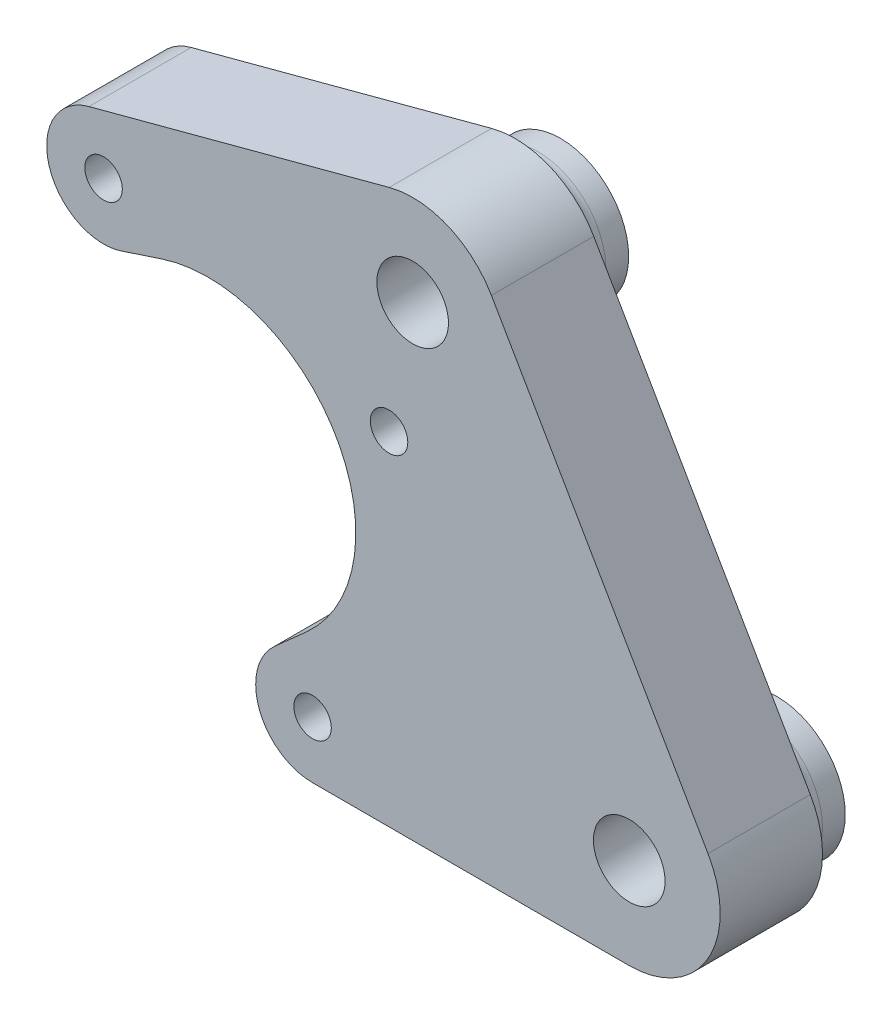
ISO-10303-21;
HEADER;
FILE_DESCRIPTION(('STEP AP214'),'2;1');
FILE_NAME('part.step','',(''),(''),'','','');
FILE_SCHEMA(('AUTOMOTIVE_DESIGN { 1 0 10303 214 1 1 1 1 }'));
ENDSEC;
DATA;
#1=APPLICATION_CONTEXT('core data for automotive mechanical design processes');
#2=APPLICATION_PROTOCOL_DEFINITION('international standard','automotive_design',2000,#1);
#3=PRODUCT_CONTEXT('',#1,'mechanical');
#4=PRODUCT('Part','Part','',(#3));
#5=PRODUCT_RELATED_PRODUCT_CATEGORY('part','',(#4));
#6=PRODUCT_DEFINITION_FORMATION('','',#4);
#7=PRODUCT_DEFINITION_CONTEXT('part definition',#1,'design');
#8=PRODUCT_DEFINITION('design','',#6,#7);
#9=PRODUCT_DEFINITION_SHAPE('','',#8);
#10=(LENGTH_UNIT() NAMED_UNIT(*) SI_UNIT(.MILLI.,.METRE.));
#11=(NAMED_UNIT(*) PLANE_ANGLE_UNIT() SI_UNIT($,.RADIAN.));
#12=(NAMED_UNIT(*) SI_UNIT($,.STERADIAN.) SOLID_ANGLE_UNIT());
#13=UNCERTAINTY_MEASURE_WITH_UNIT(LENGTH_MEASURE(1.E-05),#10,'distance_accuracy_value','');
#14=(GEOMETRIC_REPRESENTATION_CONTEXT(3) GLOBAL_UNCERTAINTY_ASSIGNED_CONTEXT((#13)) GLOBAL_UNIT_ASSIGNED_CONTEXT((#10,
#11,#12)) REPRESENTATION_CONTEXT('',''));
#15=CARTESIAN_POINT('',(0.,0.,0.));
#16=DIRECTION('',(0.,0.,1.));
#17=DIRECTION('',(1.,0.,0.));
#18=AXIS2_PLACEMENT_3D('',#15,#16,#17);
#19=CARTESIAN_POINT('',(18.,20.07,0.));
#20=DIRECTION('',(0.,0.,1.));
#21=DIRECTION('',(1.,0.,0.));
#22=AXIS2_PLACEMENT_3D('',#19,#20,#21);
#23=PLANE('',#22);
#24=DIRECTION('',(-0.499999999999998,0.86602540378444,0.));
#25=VECTOR('',#24,1.);
#26=CARTESIAN_POINT('',(24.9282032302755,24.07,0.));
#27=LINE('',#26,#25);
#28=CARTESIAN_POINT('',(43.9807032302754,-8.92989801120609,0.));
#29=VERTEX_POINT('',#28);
#30=CARTESIAN_POINT('',(24.9282032302755,24.07,0.));
#31=VERTEX_POINT('',#30);
#32=EDGE_CURVE('E240',#29,#31,#27,.T.);
#33=ORIENTED_EDGE('',*,*,#32,.F.);
#34=CARTESIAN_POINT('',(37.0524999999999,-12.9298980112061,0.));
#35=DIRECTION('',(0.,0.,1.));
#36=DIRECTION('',(1.,0.,0.));
#37=AXIS2_PLACEMENT_3D('',#34,#35,#36);
#38=CIRCLE('',#37,8.);
#39=CARTESIAN_POINT('',(37.0501411255726,-20.929897663438,0.));
#40=VERTEX_POINT('',#39);
#41=EDGE_CURVE('E317',#29,#40,#38,.T.);
#42=ORIENTED_EDGE('',*,*,#41,.T.);
#43=DIRECTION('',(0.999999956528995,-0.000294859303409234,0.));
#44=VECTOR('',#43,1.);
#45=CARTESIAN_POINT('',(37.0501411255726,-20.929897663438,0.));
#46=LINE('',#45,#44);
#47=CARTESIAN_POINT('',(9.19091385890818,-20.9216831107356,0.));
#48=VERTEX_POINT('',#47);
#49=EDGE_CURVE('E268',#48,#40,#46,.T.);
#50=ORIENTED_EDGE('',*,*,#49,.F.);
#51=CARTESIAN_POINT('',(9.19238815542522,-15.9216833280906,0.));
#52=DIRECTION('',(0.,0.,1.));
#53=DIRECTION('',(1.,0.,0.));
#54=AXIS2_PLACEMENT_3D('',#51,#52,#53);
#55=CIRCLE('',#54,5.);
#56=CARTESIAN_POINT('',(7.80290130845949,-20.7247371797676,0.));
#57=VERTEX_POINT('',#56);
#58=EDGE_CURVE('E266',#57,#48,#55,.T.);
#59=ORIENTED_EDGE('',*,*,#58,.F.);
#60=DIRECTION('',(-0.866025403784435,-0.500000000000006,0.));
#61=VECTOR('',#60,1.);
#62=CARTESIAN_POINT('',(13.8029502171025,-17.2606073272116,0.));
#63=LINE('',#62,#61);
#64=CARTESIAN_POINT('',(13.8029502171025,-17.2606073272116,0.));
#65=VERTEX_POINT('',#64);
#66=EDGE_CURVE('E446',#65,#57,#63,.T.);
#67=ORIENTED_EDGE('',*,*,#66,.F.);
#68=DIRECTION('',(-0.258819045102514,-0.96592582628907,0.));
#69=VECTOR('',#68,1.);
#70=CARTESIAN_POINT('',(20.5840091987884,8.04664932156206,0.));
#71=LINE('',#70,#69);
#72=CARTESIAN_POINT('',(20.5840091987884,8.04664932156206,0.));
#73=VERTEX_POINT('',#72);
#74=EDGE_CURVE('E174',#73,#65,#71,.T.);
#75=ORIENTED_EDGE('',*,*,#74,.F.);
#76=DIRECTION('',(0.500000000000006,-0.866025403784435,0.));
#77=VECTOR('',#76,1.);
#78=CARTESIAN_POINT('',(17.2606073272116,13.8029502171025,0.));
#79=LINE('',#78,#77);
#80=CARTESIAN_POINT('',(18.2587107953935,12.0741842990007,0.));
#81=VERTEX_POINT('',#80);
#82=EDGE_CURVE('E187',#81,#73,#79,.T.);
#83=ORIENTED_EDGE('',*,*,#82,.F.);
#84=CARTESIAN_POINT('',(18.,20.07,0.));
#85=DIRECTION('',(0.,0.,1.));
#86=DIRECTION('',(1.,0.,0.));
#87=AXIS2_PLACEMENT_3D('',#84,#85,#86);
#88=CIRCLE('',#87,8.);
#89=EDGE_CURVE('E314',#81,#31,#88,.T.);
#90=ORIENTED_EDGE('',*,*,#89,.T.);
#91=EDGE_LOOP('',(#33,#42,#50,#59,#67,#75,#83,#90));
#92=FACE_BOUND('',#91,.T.);
#93=ADVANCED_FACE('F33',(#92),#23,.F.);
#94=DIRECTION('',(-0.966218110251207,-0.257725752346532,0.));
#95=VECTOR('',#94,1.);
#96=CARTESIAN_POINT('',(15.9381939812277,27.7997448820097,0.));
#97=LINE('',#96,#95);
#98=CARTESIAN_POINT('',(15.9381939812277,27.7997448820097,0.));
#99=VERTEX_POINT('',#98);
#100=CARTESIAN_POINT('',(-10.4810169171579,20.7527738793466,0.));
#101=VERTEX_POINT('',#100);
#102=EDGE_CURVE('E261',#99,#101,#97,.T.);
#103=ORIENTED_EDGE('',*,*,#102,.F.);
#104=CARTESIAN_POINT('',(18.,20.07,0.));
#105=DIRECTION('',(0.,0.,1.));
#106=DIRECTION('',(1.,0.,0.));
#107=AXIS2_PLACEMENT_3D('',#104,#105,#106);
#108=CIRCLE('',#107,8.);
#109=CARTESIAN_POINT('',(11.5539290879817,15.3320500427684,0.));
#110=VERTEX_POINT('',#109);
#111=EDGE_CURVE('E60',#99,#110,#108,.T.);
#112=ORIENTED_EDGE('',*,*,#111,.T.);
#113=DIRECTION('',(0.96592582628907,-0.258819045102514,0.));
#114=VECTOR('',#113,1.);
#115=CARTESIAN_POINT('',(-8.04664932156206,20.5840091987884,0.));
#116=LINE('',#115,#114);
#117=CARTESIAN_POINT('',(-8.04664932156206,20.5840091987884,0.));
#118=VERTEX_POINT('',#117);
#119=EDGE_CURVE('E181',#118,#110,#116,.T.);
#120=ORIENTED_EDGE('',*,*,#119,.F.);
#121=DIRECTION('',(0.866025403784435,0.500000000000006,0.));
#122=VECTOR('',#121,1.);
#123=CARTESIAN_POINT('',(-22.3804370332829,12.3083930049193,0.));
#124=LINE('',#123,#122);
#125=CARTESIAN_POINT('',(-14.0466982302051,17.1198793462324,0.));
#126=VERTEX_POINT('',#125);
#127=EDGE_CURVE('E183',#126,#118,#124,.T.);
#128=ORIENTED_EDGE('',*,*,#127,.F.);
#129=CARTESIAN_POINT('',(-9.19238815542523,15.9216833280906,0.));
#130=DIRECTION('',(0.,0.,1.));
#131=DIRECTION('',(1.,0.,0.));
#132=AXIS2_PLACEMENT_3D('',#129,#130,#131);
#133=CIRCLE('',#132,5.);
#134=EDGE_CURVE('E263',#101,#126,#133,.T.);
#135=ORIENTED_EDGE('',*,*,#134,.F.);
#136=EDGE_LOOP('',(#103,#112,#120,#128,#135));
#137=FACE_BOUND('',#136,.T.);
#138=ADVANCED_FACE('F370',(#137),#23,.F.);
#139=CARTESIAN_POINT('',(18.,20.07,9.));
#140=DIRECTION('',(0.,0.,1.));
#141=DIRECTION('',(1.,0.,0.));
#142=AXIS2_PLACEMENT_3D('',#139,#140,#141);
#143=PLANE('',#142);
#144=CARTESIAN_POINT('',(18.,20.07,9.));
#145=DIRECTION('',(0.,0.,1.));
#146=DIRECTION('',(1.,0.,0.));
#147=AXIS2_PLACEMENT_3D('',#144,#145,#146);
#148=CIRCLE('',#147,3.15);
#149=CARTESIAN_POINT('',(21.15,20.07,9.));
#150=VERTEX_POINT('',#149);
#151=EDGE_CURVE('E223',#150,#150,#148,.T.);
#152=ORIENTED_EDGE('',*,*,#151,.F.);
#153=EDGE_LOOP('',(#152));
#154=FACE_BOUND('',#153,.T.);
#155=CARTESIAN_POINT('',(15.9216833280906,9.19238815542522,9.));
#156=DIRECTION('',(0.,0.,1.));
#157=DIRECTION('',(1.,0.,0.));
#158=AXIS2_PLACEMENT_3D('',#155,#156,#157);
#159=CIRCLE('',#158,1.65);
#160=CARTESIAN_POINT('',(17.5716833280906,9.19238815542522,9.));
#161=VERTEX_POINT('',#160);
#162=EDGE_CURVE('E229',#161,#161,#159,.T.);
#163=ORIENTED_EDGE('',*,*,#162,.F.);
#164=EDGE_LOOP('',(#163));
#165=FACE_BOUND('',#164,.T.);
#166=CARTESIAN_POINT('',(18.,20.07,9.));
#167=DIRECTION('',(0.,0.,1.));
#168=DIRECTION('',(1.,0.,0.));
#169=AXIS2_PLACEMENT_3D('',#166,#167,#168);
#170=CIRCLE('',#169,8.);
#171=CARTESIAN_POINT('',(24.9282032302755,24.07,9.));
#172=VERTEX_POINT('',#171);
#173=CARTESIAN_POINT('',(15.9381939812277,27.7997448820097,9.));
#174=VERTEX_POINT('',#173);
#175=EDGE_CURVE('E236',#172,#174,#170,.T.);
#176=ORIENTED_EDGE('',*,*,#175,.T.);
#177=DIRECTION('',(-0.966218110251207,-0.257725752346532,0.));
#178=VECTOR('',#177,1.);
#179=CARTESIAN_POINT('',(15.9381939812277,27.7997448820097,9.));
#180=LINE('',#179,#178);
#181=CARTESIAN_POINT('',(-10.4810169171579,20.7527738793466,9.));
#182=VERTEX_POINT('',#181);
#183=EDGE_CURVE('E239',#174,#182,#180,.T.);
#184=ORIENTED_EDGE('',*,*,#183,.T.);
#185=CARTESIAN_POINT('',(-9.19238815542523,15.9216833280906,9.));
#186=DIRECTION('',(0.,0.,1.));
#187=DIRECTION('',(1.,0.,0.));
#188=AXIS2_PLACEMENT_3D('',#185,#186,#187);
#189=CIRCLE('',#188,5.);
#190=CARTESIAN_POINT('',(-7.62597539265558,11.1733835211458,9.));
#191=VERTEX_POINT('',#190);
#192=EDGE_CURVE('E242',#182,#191,#189,.T.);
#193=ORIENTED_EDGE('',*,*,#192,.T.);
#194=DIRECTION('',(0.949659961388967,0.31328255255393,0.));
#195=VECTOR('',#194,1.);
#196=CARTESIAN_POINT('',(-4.07267318320108,12.3455794980566,9.));
#197=LINE('',#196,#195);
#198=CARTESIAN_POINT('',(-4.07267318320108,12.3455794980566,9.));
#199=VERTEX_POINT('',#198);
#200=EDGE_CURVE('E244',#191,#199,#197,.T.);
#201=ORIENTED_EDGE('',*,*,#200,.T.);
#202=CARTESIAN_POINT('',(0.,0.,9.));
#203=DIRECTION('',(0.,0.,-1.));
#204=DIRECTION('',(1.,0.,0.));
#205=AXIS2_PLACEMENT_3D('',#202,#203,#204);
#206=CIRCLE('',#205,13.);
#207=CARTESIAN_POINT('',(8.65524887815692,-9.69982818699195,9.));
#208=VERTEX_POINT('',#207);
#209=EDGE_CURVE('E246',#199,#208,#206,.T.);
#210=ORIENTED_EDGE('',*,*,#209,.T.);
#211=DIRECTION('',(-0.746140629768612,-0.665788375242839,0.));
#212=VECTOR('',#211,1.);
#213=CARTESIAN_POINT('',(8.65524887815692,-9.69982818699195,9.));
#214=LINE('',#213,#212);
#215=CARTESIAN_POINT('',(5.86344627921102,-12.1909801792475,9.));
#216=VERTEX_POINT('',#215);
#217=EDGE_CURVE('E248',#208,#216,#214,.T.);
#218=ORIENTED_EDGE('',*,*,#217,.T.);
#219=CARTESIAN_POINT('',(9.19238815542522,-15.9216833280906,9.));
#220=DIRECTION('',(0.,0.,1.));
#221=DIRECTION('',(1.,0.,0.));
#222=AXIS2_PLACEMENT_3D('',#219,#220,#221);
#223=CIRCLE('',#222,5.);
#224=CARTESIAN_POINT('',(9.19091385890818,-20.9216831107356,9.));
#225=VERTEX_POINT('',#224);
#226=EDGE_CURVE('E250',#216,#225,#223,.T.);
#227=ORIENTED_EDGE('',*,*,#226,.T.);
#228=DIRECTION('',(0.999999956528995,-0.000294859303409234,0.));
#229=VECTOR('',#228,1.);
#230=CARTESIAN_POINT('',(37.0501411255726,-20.929897663438,9.));
#231=LINE('',#230,#229);
#232=CARTESIAN_POINT('',(37.0501411255726,-20.929897663438,9.));
#233=VERTEX_POINT('',#232);
#234=EDGE_CURVE('E252',#225,#233,#231,.T.);
#235=ORIENTED_EDGE('',*,*,#234,.T.);
#236=CARTESIAN_POINT('',(37.0524999999999,-12.9298980112061,9.));
#237=DIRECTION('',(0.,0.,1.));
#238=DIRECTION('',(1.,0.,0.));
#239=AXIS2_PLACEMENT_3D('',#236,#237,#238);
#240=CIRCLE('',#239,8.);
#241=CARTESIAN_POINT('',(43.9807032302754,-8.92989801120609,9.));
#242=VERTEX_POINT('',#241);
#243=EDGE_CURVE('E254',#233,#242,#240,.T.);
#244=ORIENTED_EDGE('',*,*,#243,.T.);
#245=DIRECTION('',(-0.499999999999998,0.86602540378444,0.));
#246=VECTOR('',#245,1.);
#247=CARTESIAN_POINT('',(24.9282032302755,24.07,9.));
#248=LINE('',#247,#246);
#249=EDGE_CURVE('E256',#242,#172,#248,.T.);
#250=ORIENTED_EDGE('',*,*,#249,.T.);
#251=EDGE_LOOP('',(#176,#184,#193,#201,#210,#218,#227,#235,#244,#250));
#252=FACE_BOUND('',#251,.T.);
#253=CARTESIAN_POINT('',(-9.19238815542523,15.9216833280906,9.));
#254=DIRECTION('',(0.,0.,1.));
#255=DIRECTION('',(1.,0.,0.));
#256=AXIS2_PLACEMENT_3D('',#253,#254,#255);
#257=CIRCLE('',#256,1.65);
#258=CARTESIAN_POINT('',(-7.54238815542522,15.9216833280906,9.));
#259=VERTEX_POINT('',#258);
#260=EDGE_CURVE('E232',#259,#259,#257,.T.);
#261=ORIENTED_EDGE('',*,*,#260,.F.);
#262=EDGE_LOOP('',(#261));
#263=FACE_BOUND('',#262,.T.);
#264=CARTESIAN_POINT('',(9.19238815542522,-15.9216833280906,9.));
#265=DIRECTION('',(0.,0.,1.));
#266=DIRECTION('',(1.,0.,0.));
#267=AXIS2_PLACEMENT_3D('',#264,#265,#266);
#268=CIRCLE('',#267,1.65);
#269=CARTESIAN_POINT('',(10.8423881554252,-15.9216833280906,9.));
#270=VERTEX_POINT('',#269);
#271=EDGE_CURVE('E226',#270,#270,#268,.T.);
#272=ORIENTED_EDGE('',*,*,#271,.F.);
#273=EDGE_LOOP('',(#272));
#274=FACE_BOUND('',#273,.T.);
#275=CARTESIAN_POINT('',(37.0524999999999,-12.9298980112061,9.));
#276=DIRECTION('',(0.,0.,1.));
#277=DIRECTION('',(1.,0.,0.));
#278=AXIS2_PLACEMENT_3D('',#275,#276,#277);
#279=CIRCLE('',#278,3.14999999999999);
#280=CARTESIAN_POINT('',(40.2024999999999,-12.9298980112061,9.));
#281=VERTEX_POINT('',#280);
#282=EDGE_CURVE('E220',#281,#281,#279,.T.);
#283=ORIENTED_EDGE('',*,*,#282,.F.);
#284=EDGE_LOOP('',(#283));
#285=FACE_BOUND('',#284,.T.);
#286=ADVANCED_FACE('F366',(#154,#165,#252,#263,#274,#285),#143,.T.);
#287=CARTESIAN_POINT('',(18.,20.07,9.));
#288=DIRECTION('',(0.,0.,-1.));
#289=DIRECTION('',(-1.,0.,0.));
#290=AXIS2_PLACEMENT_3D('',#287,#288,#289);
#291=CYLINDRICAL_SURFACE('',#290,8.);
#292=CARTESIAN_POINT('',(18.,20.07,0.));
#293=DIRECTION('',(0.,0.,1.));
#294=DIRECTION('',(1.,0.,0.));
#295=AXIS2_PLACEMENT_3D('',#292,#293,#294);
#296=CIRCLE('',#295,8.);
#297=EDGE_CURVE('E235',#31,#99,#296,.T.);
#298=ORIENTED_EDGE('',*,*,#297,.T.);
#299=DIRECTION('',(0.,0.,-1.));
#300=VECTOR('',#299,1.);
#301=CARTESIAN_POINT('',(15.9381939812277,27.7997448820097,9.));
#302=LINE('',#301,#300);
#303=EDGE_CURVE('E301',#174,#99,#302,.T.);
#304=ORIENTED_EDGE('',*,*,#303,.F.);
#305=ORIENTED_EDGE('',*,*,#175,.F.);
#306=DIRECTION('',(0.,0.,-1.));
#307=VECTOR('',#306,1.);
#308=CARTESIAN_POINT('',(24.9282032302755,24.07,9.));
#309=LINE('',#308,#307);
#310=EDGE_CURVE('E258',#172,#31,#309,.T.);
#311=ORIENTED_EDGE('',*,*,#310,.T.);
#312=EDGE_LOOP('',(#298,#304,#305,#311));
#313=FACE_BOUND('',#312,.T.);
#314=ADVANCED_FACE('F369',(#313),#291,.T.);
#315=CARTESIAN_POINT('',(15.9381939812277,27.7997448820097,9.));
#316=DIRECTION('',(0.257725752346532,-0.966218110251207,0.));
#317=DIRECTION('',(0.966218110251207,0.257725752346532,0.));
#318=AXIS2_PLACEMENT_3D('',#315,#316,#317);
#319=PLANE('',#318);
#320=ORIENTED_EDGE('',*,*,#102,.T.);
#321=DIRECTION('',(0.,0.,-1.));
#322=VECTOR('',#321,1.);
#323=CARTESIAN_POINT('',(-10.4810169171579,20.7527738793466,9.));
#324=LINE('',#323,#322);
#325=EDGE_CURVE('E298',#182,#101,#324,.T.);
#326=ORIENTED_EDGE('',*,*,#325,.F.);
#327=ORIENTED_EDGE('',*,*,#183,.F.);
#328=ORIENTED_EDGE('',*,*,#303,.T.);
#329=EDGE_LOOP('',(#320,#326,#327,#328));
#330=FACE_BOUND('',#329,.T.);
#331=ADVANCED_FACE('F404',(#330),#319,.F.);
#332=CARTESIAN_POINT('',(-9.19238815542523,15.9216833280906,9.));
#333=DIRECTION('',(0.,0.,-1.));
#334=DIRECTION('',(-1.,0.,0.));
#335=AXIS2_PLACEMENT_3D('',#332,#333,#334);
#336=CYLINDRICAL_SURFACE('',#335,5.);
#337=DIRECTION('',(0.,0.,-1.));
#338=VECTOR('',#337,1.);
#339=CARTESIAN_POINT('',(-14.0466982302051,17.1198793462324,9.));
#340=LINE('',#339,#338);
#341=CARTESIAN_POINT('',(-14.0466982302051,17.1198793462324,3.));
#342=VERTEX_POINT('',#341);
#343=EDGE_CURVE('E307',#126,#342,#340,.F.);
#344=ORIENTED_EDGE('',*,*,#343,.T.);
#345=CARTESIAN_POINT('',(-9.19238815542523,15.9216833280906,3.));
#346=DIRECTION('',(0.,0.,1.));
#347=DIRECTION('',(1.,0.,0.));
#348=AXIS2_PLACEMENT_3D('',#345,#346,#347);
#349=CIRCLE('',#348,5.);
#350=CARTESIAN_POINT('',(-7.62597539265558,11.1733835211458,3.));
#351=VERTEX_POINT('',#350);
#352=EDGE_CURVE('E217',#342,#351,#349,.T.);
#353=ORIENTED_EDGE('',*,*,#352,.T.);
#354=DIRECTION('',(0.,0.,-1.));
#355=VECTOR('',#354,1.);
#356=CARTESIAN_POINT('',(-7.62597539265558,11.1733835211458,9.));
#357=LINE('',#356,#355);
#358=EDGE_CURVE('E295',#191,#351,#357,.T.);
#359=ORIENTED_EDGE('',*,*,#358,.F.);
#360=ORIENTED_EDGE('',*,*,#192,.F.);
#361=ORIENTED_EDGE('',*,*,#325,.T.);
#362=ORIENTED_EDGE('',*,*,#134,.T.);
#363=EDGE_LOOP('',(#344,#353,#359,#360,#361,#362));
#364=FACE_BOUND('',#363,.T.);
#365=ADVANCED_FACE('F400',(#364),#336,.T.);
#366=CARTESIAN_POINT('',(-4.07267318320108,12.3455794980566,9.));
#367=DIRECTION('',(-0.31328255255393,0.949659961388967,0.));
#368=DIRECTION('',(-0.949659961388967,-0.31328255255393,0.));
#369=AXIS2_PLACEMENT_3D('',#366,#367,#368);
#370=PLANE('',#369);
#371=ORIENTED_EDGE('',*,*,#358,.T.);
#372=DIRECTION('',(0.949659961388967,0.31328255255393,0.));
#373=VECTOR('',#372,1.);
#374=CARTESIAN_POINT('',(-4.07267318320108,12.3455794980566,3.));
#375=LINE('',#374,#373);
#376=CARTESIAN_POINT('',(-4.07267318320108,12.3455794980566,3.));
#377=VERTEX_POINT('',#376);
#378=EDGE_CURVE('E214',#351,#377,#375,.T.);
#379=ORIENTED_EDGE('',*,*,#378,.T.);
#380=DIRECTION('',(0.,0.,-1.));
#381=VECTOR('',#380,1.);
#382=CARTESIAN_POINT('',(-4.07267318320108,12.3455794980566,9.));
#383=LINE('',#382,#381);
#384=EDGE_CURVE('E292',#199,#377,#383,.T.);
#385=ORIENTED_EDGE('',*,*,#384,.F.);
#386=ORIENTED_EDGE('',*,*,#200,.F.);
#387=EDGE_LOOP('',(#371,#379,#385,#386));
#388=FACE_BOUND('',#387,.T.);
#389=ADVANCED_FACE('F396',(#388),#370,.F.);
#390=CARTESIAN_POINT('',(0.,0.,9.));
#391=DIRECTION('',(0.,0.,-1.));
#392=DIRECTION('',(-1.,0.,0.));
#393=AXIS2_PLACEMENT_3D('',#390,#391,#392);
#394=CYLINDRICAL_SURFACE('',#393,13.);
#395=ORIENTED_EDGE('',*,*,#384,.T.);
#396=CARTESIAN_POINT('',(0.,0.,3.));
#397=DIRECTION('',(0.,0.,1.));
#398=DIRECTION('',(1.,0.,0.));
#399=AXIS2_PLACEMENT_3D('',#396,#397,#398);
#400=CIRCLE('',#399,13.);
#401=CARTESIAN_POINT('',(8.65524887815692,-9.69982818699195,3.));
#402=VERTEX_POINT('',#401);
#403=EDGE_CURVE('E211',#377,#402,#400,.F.);
#404=ORIENTED_EDGE('',*,*,#403,.T.);
#405=DIRECTION('',(0.,0.,-1.));
#406=VECTOR('',#405,1.);
#407=CARTESIAN_POINT('',(8.65524887815692,-9.69982818699195,9.));
#408=LINE('',#407,#406);
#409=EDGE_CURVE('E289',#208,#402,#408,.T.);
#410=ORIENTED_EDGE('',*,*,#409,.F.);
#411=ORIENTED_EDGE('',*,*,#209,.F.);
#412=EDGE_LOOP('',(#395,#404,#410,#411));
#413=FACE_BOUND('',#412,.T.);
#414=ADVANCED_FACE('F392',(#413),#394,.F.);
#415=CARTESIAN_POINT('',(8.65524887815692,-9.69982818699195,9.));
#416=DIRECTION('',(0.665788375242839,-0.746140629768612,0.));
#417=DIRECTION('',(0.746140629768612,0.665788375242839,0.));
#418=AXIS2_PLACEMENT_3D('',#415,#416,#417);
#419=PLANE('',#418);
#420=ORIENTED_EDGE('',*,*,#409,.T.);
#421=DIRECTION('',(-0.746140629768612,-0.665788375242839,0.));
#422=VECTOR('',#421,1.);
#423=CARTESIAN_POINT('',(8.65524887815692,-9.69982818699195,3.));
#424=LINE('',#423,#422);
#425=CARTESIAN_POINT('',(5.86344627921102,-12.1909801792475,3.));
#426=VERTEX_POINT('',#425);
#427=EDGE_CURVE('E208',#402,#426,#424,.T.);
#428=ORIENTED_EDGE('',*,*,#427,.T.);
#429=DIRECTION('',(0.,0.,-1.));
#430=VECTOR('',#429,1.);
#431=CARTESIAN_POINT('',(5.86344627921102,-12.1909801792475,9.));
#432=LINE('',#431,#430);
#433=EDGE_CURVE('E286',#216,#426,#432,.T.);
#434=ORIENTED_EDGE('',*,*,#433,.F.);
#435=ORIENTED_EDGE('',*,*,#217,.F.);
#436=EDGE_LOOP('',(#420,#428,#434,#435));
#437=FACE_BOUND('',#436,.T.);
#438=ADVANCED_FACE('F388',(#437),#419,.F.);
#439=CARTESIAN_POINT('',(9.19238815542522,-15.9216833280906,9.));
#440=DIRECTION('',(0.,0.,-1.));
#441=DIRECTION('',(-1.,0.,0.));
#442=AXIS2_PLACEMENT_3D('',#439,#440,#441);
#443=CYLINDRICAL_SURFACE('',#442,5.);
#444=ORIENTED_EDGE('',*,*,#433,.T.);
#445=CARTESIAN_POINT('',(9.19238815542522,-15.9216833280906,3.));
#446=DIRECTION('',(0.,0.,1.));
#447=DIRECTION('',(1.,0.,0.));
#448=AXIS2_PLACEMENT_3D('',#445,#446,#447);
#449=CIRCLE('',#448,5.);
#450=CARTESIAN_POINT('',(7.80290130845949,-20.7247371797676,3.));
#451=VERTEX_POINT('',#450);
#452=EDGE_CURVE('E206',#426,#451,#449,.T.);
#453=ORIENTED_EDGE('',*,*,#452,.T.);
#454=DIRECTION('',(0.,0.,-1.));
#455=VECTOR('',#454,1.);
#456=CARTESIAN_POINT('',(7.80290130845949,-20.7247371797676,9.));
#457=LINE('',#456,#455);
#458=EDGE_CURVE('E162',#451,#57,#457,.T.);
#459=ORIENTED_EDGE('',*,*,#458,.T.);
#460=ORIENTED_EDGE('',*,*,#58,.T.);
#461=DIRECTION('',(0.,0.,-1.));
#462=VECTOR('',#461,1.);
#463=CARTESIAN_POINT('',(9.19091385890818,-20.9216831107356,9.));
#464=LINE('',#463,#462);
#465=EDGE_CURVE('E283',#225,#48,#464,.T.);
#466=ORIENTED_EDGE('',*,*,#465,.F.);
#467=ORIENTED_EDGE('',*,*,#226,.F.);
#468=EDGE_LOOP('',(#444,#453,#459,#460,#466,#467));
#469=FACE_BOUND('',#468,.T.);
#470=ADVANCED_FACE('F384',(#469),#443,.T.);
#471=CARTESIAN_POINT('',(37.0501411255726,-20.929897663438,9.));
#472=DIRECTION('',(0.000294859303409234,0.999999956528995,0.));
#473=DIRECTION('',(-0.999999956528995,0.000294859303409234,0.));
#474=AXIS2_PLACEMENT_3D('',#471,#472,#473);
#475=PLANE('',#474);
#476=ORIENTED_EDGE('',*,*,#49,.T.);
#477=DIRECTION('',(0.,0.,-1.));
#478=VECTOR('',#477,1.);
#479=CARTESIAN_POINT('',(37.0501411255726,-20.929897663438,9.));
#480=LINE('',#479,#478);
#481=EDGE_CURVE('E280',#233,#40,#480,.T.);
#482=ORIENTED_EDGE('',*,*,#481,.F.);
#483=ORIENTED_EDGE('',*,*,#234,.F.);
#484=ORIENTED_EDGE('',*,*,#465,.T.);
#485=EDGE_LOOP('',(#476,#482,#483,#484));
#486=FACE_BOUND('',#485,.T.);
#487=ADVANCED_FACE('F380',(#486),#475,.F.);
#488=CARTESIAN_POINT('',(37.0524999999999,-12.9298980112061,9.));
#489=DIRECTION('',(0.,0.,-1.));
#490=DIRECTION('',(-1.,0.,0.));
#491=AXIS2_PLACEMENT_3D('',#488,#489,#490);
#492=CYLINDRICAL_SURFACE('',#491,8.);
#493=CARTESIAN_POINT('',(37.0524999999999,-12.9298980112061,0.));
#494=DIRECTION('',(0.,0.,1.));
#495=DIRECTION('',(1.,0.,0.));
#496=AXIS2_PLACEMENT_3D('',#493,#494,#495);
#497=CIRCLE('',#496,8.);
#498=EDGE_CURVE('E271',#40,#29,#497,.T.);
#499=ORIENTED_EDGE('',*,*,#498,.T.);
#500=DIRECTION('',(0.,0.,-1.));
#501=VECTOR('',#500,1.);
#502=CARTESIAN_POINT('',(43.9807032302754,-8.92989801120609,9.));
#503=LINE('',#502,#501);
#504=EDGE_CURVE('E277',#242,#29,#503,.T.);
#505=ORIENTED_EDGE('',*,*,#504,.F.);
#506=ORIENTED_EDGE('',*,*,#243,.F.);
#507=ORIENTED_EDGE('',*,*,#481,.T.);
#508=EDGE_LOOP('',(#499,#505,#506,#507));
#509=FACE_BOUND('',#508,.T.);
#510=ADVANCED_FACE('F376',(#509),#492,.T.);
#511=CARTESIAN_POINT('',(24.9282032302755,24.07,9.));
#512=DIRECTION('',(-0.86602540378444,-0.499999999999998,0.));
#513=DIRECTION('',(0.499999999999998,-0.86602540378444,0.));
#514=AXIS2_PLACEMENT_3D('',#511,#512,#513);
#515=PLANE('',#514);
#516=ORIENTED_EDGE('',*,*,#32,.T.);
#517=ORIENTED_EDGE('',*,*,#310,.F.);
#518=ORIENTED_EDGE('',*,*,#249,.F.);
#519=ORIENTED_EDGE('',*,*,#504,.T.);
#520=EDGE_LOOP('',(#516,#517,#518,#519));
#521=FACE_BOUND('',#520,.T.);
#522=ADVANCED_FACE('F364',(#521),#515,.F.);
#523=CARTESIAN_POINT('',(-9.19238815542523,15.9216833280906,9.));
#524=DIRECTION('',(0.,0.,-1.));
#525=DIRECTION('',(-1.,0.,0.));
#526=AXIS2_PLACEMENT_3D('',#523,#524,#525);
#527=CYLINDRICAL_SURFACE('',#526,1.65);
#528=CARTESIAN_POINT('',(-9.19238815542523,15.9216833280906,3.));
#529=DIRECTION('',(0.,0.,1.));
#530=DIRECTION('',(1.,0.,0.));
#531=AXIS2_PLACEMENT_3D('',#528,#529,#530);
#532=CIRCLE('',#531,1.65);
#533=CARTESIAN_POINT('',(-7.54238815542522,15.9216833280906,3.));
#534=VERTEX_POINT('',#533);
#535=EDGE_CURVE('E203',#534,#534,#532,.T.);
#536=ORIENTED_EDGE('',*,*,#535,.F.);
#537=EDGE_LOOP('',(#536));
#538=FACE_BOUND('',#537,.T.);
#539=ORIENTED_EDGE('',*,*,#260,.T.);
#540=EDGE_LOOP('',(#539));
#541=FACE_BOUND('',#540,.T.);
#542=ADVANCED_FACE('F360',(#538,#541),#527,.F.);
#543=CARTESIAN_POINT('',(15.9216833280906,9.19238815542522,9.));
#544=DIRECTION('',(0.,0.,-1.));
#545=DIRECTION('',(-1.,0.,0.));
#546=AXIS2_PLACEMENT_3D('',#543,#544,#545);
#547=CYLINDRICAL_SURFACE('',#546,1.65);
#548=CARTESIAN_POINT('',(15.9216833280906,9.19238815542522,3.));
#549=DIRECTION('',(0.,0.,1.));
#550=DIRECTION('',(1.,0.,0.));
#551=AXIS2_PLACEMENT_3D('',#548,#549,#550);
#552=CIRCLE('',#551,1.65);
#553=CARTESIAN_POINT('',(17.5716833280906,9.19238815542522,3.));
#554=VERTEX_POINT('',#553);
#555=EDGE_CURVE('E200',#554,#554,#552,.T.);
#556=ORIENTED_EDGE('',*,*,#555,.F.);
#557=EDGE_LOOP('',(#556));
#558=FACE_BOUND('',#557,.T.);
#559=ORIENTED_EDGE('',*,*,#162,.T.);
#560=EDGE_LOOP('',(#559));
#561=FACE_BOUND('',#560,.T.);
#562=ADVANCED_FACE('F356',(#558,#561),#547,.F.);
#563=CARTESIAN_POINT('',(9.19238815542522,-15.9216833280906,9.));
#564=DIRECTION('',(0.,0.,-1.));
#565=DIRECTION('',(-1.,0.,0.));
#566=AXIS2_PLACEMENT_3D('',#563,#564,#565);
#567=CYLINDRICAL_SURFACE('',#566,1.65);
#568=CARTESIAN_POINT('',(9.19238815542522,-15.9216833280906,3.));
#569=DIRECTION('',(0.,0.,1.));
#570=DIRECTION('',(1.,0.,0.));
#571=AXIS2_PLACEMENT_3D('',#568,#569,#570);
#572=CIRCLE('',#571,1.65);
#573=CARTESIAN_POINT('',(10.8423881554252,-15.9216833280906,3.));
#574=VERTEX_POINT('',#573);
#575=EDGE_CURVE('E199',#574,#574,#572,.T.);
#576=ORIENTED_EDGE('',*,*,#575,.F.);
#577=EDGE_LOOP('',(#576));
#578=FACE_BOUND('',#577,.T.);
#579=ORIENTED_EDGE('',*,*,#271,.T.);
#580=EDGE_LOOP('',(#579));
#581=FACE_BOUND('',#580,.T.);
#582=ADVANCED_FACE('F352',(#578,#581),#567,.F.);
#583=CARTESIAN_POINT('',(18.,20.07,9.));
#584=DIRECTION('',(0.,0.,-1.));
#585=DIRECTION('',(-1.,0.,0.));
#586=AXIS2_PLACEMENT_3D('',#583,#584,#585);
#587=CYLINDRICAL_SURFACE('',#586,3.15);
#588=ORIENTED_EDGE('',*,*,#151,.T.);
#589=EDGE_LOOP('',(#588));
#590=FACE_BOUND('',#589,.T.);
#591=CARTESIAN_POINT('',(18.,20.07,-4.));
#592=DIRECTION('',(0.,0.,-1.));
#593=DIRECTION('',(-1.,0.,0.));
#594=AXIS2_PLACEMENT_3D('',#591,#592,#593);
#595=CIRCLE('',#594,3.15);
#596=CARTESIAN_POINT('',(14.85,20.07,-4.));
#597=VERTEX_POINT('',#596);
#598=EDGE_CURVE('E467',#597,#597,#595,.T.);
#599=ORIENTED_EDGE('',*,*,#598,.T.);
#600=EDGE_LOOP('',(#599));
#601=FACE_BOUND('',#600,.T.);
#602=ADVANCED_FACE('F348',(#590,#601),#587,.F.);
#603=CARTESIAN_POINT('',(37.0524999999999,-12.9298980112061,9.));
#604=DIRECTION('',(0.,0.,-1.));
#605=DIRECTION('',(-1.,0.,0.));
#606=AXIS2_PLACEMENT_3D('',#603,#604,#605);
#607=CYLINDRICAL_SURFACE('',#606,3.14999999999999);
#608=ORIENTED_EDGE('',*,*,#282,.T.);
#609=EDGE_LOOP('',(#608));
#610=FACE_BOUND('',#609,.T.);
#611=CARTESIAN_POINT('',(37.0524999999999,-12.9298980112061,-4.));
#612=DIRECTION('',(0.,0.,-1.));
#613=DIRECTION('',(-1.,0.,0.));
#614=AXIS2_PLACEMENT_3D('',#611,#612,#613);
#615=CIRCLE('',#614,3.14999999999999);
#616=CARTESIAN_POINT('',(33.9024999999999,-12.9298980112061,-4.));
#617=VERTEX_POINT('',#616);
#618=EDGE_CURVE('E478',#617,#617,#615,.T.);
#619=ORIENTED_EDGE('',*,*,#618,.T.);
#620=EDGE_LOOP('',(#619));
#621=FACE_BOUND('',#620,.T.);
#622=ADVANCED_FACE('F337',(#610,#621),#607,.F.);
#623=CARTESIAN_POINT('',(-22.3804370332829,12.3083930049193,75.807638297111));
#624=DIRECTION('',(-0.500000000000006,0.866025403784435,0.));
#625=DIRECTION('',(-0.866025403784435,-0.500000000000006,0.));
#626=AXIS2_PLACEMENT_3D('',#623,#624,#625);
#627=PLANE('',#626);
#628=ORIENTED_EDGE('',*,*,#127,.T.);
#629=DIRECTION('',(0.,0.,-1.));
#630=VECTOR('',#629,1.);
#631=CARTESIAN_POINT('',(-8.04664932156206,20.5840091987884,75.807638297111));
#632=LINE('',#631,#630);
#633=CARTESIAN_POINT('',(-8.04664932156206,20.5840091987884,3.));
#634=VERTEX_POINT('',#633);
#635=EDGE_CURVE('E193',#634,#118,#632,.T.);
#636=ORIENTED_EDGE('',*,*,#635,.F.);
#637=DIRECTION('',(0.866025403784435,0.500000000000006,0.));
#638=VECTOR('',#637,1.);
#639=CARTESIAN_POINT('',(-22.3804370332829,12.3083930049193,3.));
#640=LINE('',#639,#638);
#641=EDGE_CURVE('E166',#342,#634,#640,.T.);
#642=ORIENTED_EDGE('',*,*,#641,.F.);
#643=ORIENTED_EDGE('',*,*,#343,.F.);
#644=EDGE_LOOP('',(#628,#636,#642,#643));
#645=FACE_BOUND('',#644,.T.);
#646=ADVANCED_FACE('F334',(#645),#627,.F.);
#647=CARTESIAN_POINT('',(13.8029502171025,-17.2606073272116,75.807638297111));
#648=DIRECTION('',(0.500000000000006,-0.866025403784435,0.));
#649=DIRECTION('',(0.866025403784435,0.500000000000006,0.));
#650=AXIS2_PLACEMENT_3D('',#647,#648,#649);
#651=PLANE('',#650);
#652=DIRECTION('',(-0.866025403784435,-0.500000000000006,0.));
#653=VECTOR('',#652,1.);
#654=CARTESIAN_POINT('',(13.8029502171025,-17.2606073272116,3.));
#655=LINE('',#654,#653);
#656=CARTESIAN_POINT('',(13.8029502171025,-17.2606073272116,3.));
#657=VERTEX_POINT('',#656);
#658=EDGE_CURVE('E156',#657,#451,#655,.T.);
#659=ORIENTED_EDGE('',*,*,#658,.F.);
#660=DIRECTION('',(0.,0.,-1.));
#661=VECTOR('',#660,1.);
#662=CARTESIAN_POINT('',(13.8029502171025,-17.2606073272116,75.807638297111));
#663=LINE('',#662,#661);
#664=EDGE_CURVE('E159',#657,#65,#663,.T.);
#665=ORIENTED_EDGE('',*,*,#664,.T.);
#666=ORIENTED_EDGE('',*,*,#66,.T.);
#667=ORIENTED_EDGE('',*,*,#458,.F.);
#668=EDGE_LOOP('',(#659,#665,#666,#667));
#669=FACE_BOUND('',#668,.T.);
#670=ADVANCED_FACE('F158',(#669),#651,.F.);
#671=CARTESIAN_POINT('',(18.,20.07,3.));
#672=DIRECTION('',(0.,0.,1.));
#673=DIRECTION('',(1.,0.,0.));
#674=AXIS2_PLACEMENT_3D('',#671,#672,#673);
#675=PLANE('',#674);
#676=ORIENTED_EDGE('',*,*,#575,.T.);
#677=EDGE_LOOP('',(#676));
#678=FACE_BOUND('',#677,.T.);
#679=ORIENTED_EDGE('',*,*,#555,.T.);
#680=EDGE_LOOP('',(#679));
#681=FACE_BOUND('',#680,.T.);
#682=ORIENTED_EDGE('',*,*,#535,.T.);
#683=EDGE_LOOP('',(#682));
#684=FACE_BOUND('',#683,.T.);
#685=ORIENTED_EDGE('',*,*,#641,.T.);
#686=DIRECTION('',(0.96592582628907,-0.258819045102514,0.));
#687=VECTOR('',#686,1.);
#688=CARTESIAN_POINT('',(-8.04664932156206,20.5840091987884,3.));
#689=LINE('',#688,#687);
#690=CARTESIAN_POINT('',(17.2606073272116,13.8029502171025,3.));
#691=VERTEX_POINT('',#690);
#692=EDGE_CURVE('E191',#634,#691,#689,.T.);
#693=ORIENTED_EDGE('',*,*,#692,.T.);
#694=DIRECTION('',(0.500000000000006,-0.866025403784435,0.));
#695=VECTOR('',#694,1.);
#696=CARTESIAN_POINT('',(17.2606073272116,13.8029502171025,3.));
#697=LINE('',#696,#695);
#698=CARTESIAN_POINT('',(20.5840091987884,8.04664932156206,3.));
#699=VERTEX_POINT('',#698);
#700=EDGE_CURVE('E179',#691,#699,#697,.T.);
#701=ORIENTED_EDGE('',*,*,#700,.T.);
#702=DIRECTION('',(-0.258819045102514,-0.96592582628907,0.));
#703=VECTOR('',#702,1.);
#704=CARTESIAN_POINT('',(20.5840091987884,8.04664932156206,3.));
#705=LINE('',#704,#703);
#706=EDGE_CURVE('E171',#699,#657,#705,.T.);
#707=ORIENTED_EDGE('',*,*,#706,.T.);
#708=ORIENTED_EDGE('',*,*,#658,.T.);
#709=ORIENTED_EDGE('',*,*,#452,.F.);
#710=ORIENTED_EDGE('',*,*,#427,.F.);
#711=ORIENTED_EDGE('',*,*,#403,.F.);
#712=ORIENTED_EDGE('',*,*,#378,.F.);
#713=ORIENTED_EDGE('',*,*,#352,.F.);
#714=EDGE_LOOP('',(#685,#693,#701,#707,#708,#709,#710,#711,#712,#713));
#715=FACE_BOUND('',#714,.T.);
#716=ADVANCED_FACE('F177',(#678,#681,#684,#715),#675,.F.);
#717=CARTESIAN_POINT('',(20.5840091987884,8.04664932156206,75.807638297111));
#718=DIRECTION('',(0.96592582628907,-0.258819045102514,0.));
#719=DIRECTION('',(0.258819045102514,0.96592582628907,0.));
#720=AXIS2_PLACEMENT_3D('',#717,#718,#719);
#721=PLANE('',#720);
#722=DIRECTION('',(0.,0.,-1.));
#723=VECTOR('',#722,1.);
#724=CARTESIAN_POINT('',(20.5840091987884,8.04664932156206,75.807638297111));
#725=LINE('',#724,#723);
#726=EDGE_CURVE('E190',#699,#73,#725,.T.);
#727=ORIENTED_EDGE('',*,*,#726,.T.);
#728=ORIENTED_EDGE('',*,*,#74,.T.);
#729=ORIENTED_EDGE('',*,*,#664,.F.);
#730=ORIENTED_EDGE('',*,*,#706,.F.);
#731=EDGE_LOOP('',(#727,#728,#729,#730));
#732=FACE_BOUND('',#731,.T.);
#733=ADVANCED_FACE('F170',(#732),#721,.F.);
#734=CARTESIAN_POINT('',(-8.04664932156206,20.5840091987884,75.807638297111));
#735=DIRECTION('',(0.258819045102514,0.96592582628907,0.));
#736=DIRECTION('',(-0.96592582628907,0.258819045102514,0.));
#737=AXIS2_PLACEMENT_3D('',#734,#735,#736);
#738=PLANE('',#737);
#739=ORIENTED_EDGE('',*,*,#635,.T.);
#740=ORIENTED_EDGE('',*,*,#119,.T.);
#741=CARTESIAN_POINT('',(11.5539290879817,15.3320500427684,0.));
#742=CARTESIAN_POINT('',(11.6553765355848,15.3048672811089,-7.92441224306718E-06));
#743=CARTESIAN_POINT('',(11.7567753416415,15.2776975529126,-0.00323047741304689));
#744=CARTESIAN_POINT('',(11.9591762242755,15.2234643998634,-0.0154126053806329));
#745=CARTESIAN_POINT('',(12.0601785515567,15.1964009078348,-0.0243676322217743));
#746=CARTESIAN_POINT('',(12.3616892315702,15.1156113646158,-0.0587240758592523));
#747=CARTESIAN_POINT('',(12.5614028847571,15.0620982525269,-0.0916265177050164));
#748=CARTESIAN_POINT('',(12.963602017559,14.9543293196961,-0.173675342768456));
#749=CARTESIAN_POINT('',(13.1659979487997,14.9000974933688,-0.22326832010627));
#750=CARTESIAN_POINT('',(13.5680358030441,14.7923717749973,-0.333332557007556));
#751=CARTESIAN_POINT('',(13.7676763202803,14.7388782596273,-0.393809163291006));
#752=CARTESIAN_POINT('',(14.0776993631094,14.6558078356663,-0.492242959594561));
#753=CARTESIAN_POINT('',(14.1886415117476,14.6260809765321,-0.528377874889303));
#754=CARTESIAN_POINT('',(14.41037748583,14.5666670013438,-0.601136025252127));
#755=CARTESIAN_POINT('',(14.5211713115163,14.5369798852248,-0.637759259522268));
#756=CARTESIAN_POINT('',(14.7432646401714,14.4774701571673,-0.710150817310032));
#757=CARTESIAN_POINT('',(14.8545647105322,14.4476473931966,-0.745917296850563));
#758=CARTESIAN_POINT('',(15.0779987391669,14.3877784256623,-0.814681967198861));
#759=CARTESIAN_POINT('',(15.1901328358118,14.3577321850223,-0.847679686969477));
#760=CARTESIAN_POINT('',(15.4126850075624,14.2980995103279,-0.907643135023587));
#761=CARTESIAN_POINT('',(15.5230669904523,14.2685227471536,-0.934748333366864));
#762=CARTESIAN_POINT('',(15.7453666574526,14.2089577309032,-0.98122613333572));
#763=CARTESIAN_POINT('',(15.8572838091586,14.1789696204844,-1.00060134896456));
#764=CARTESIAN_POINT('',(16.0818219768671,14.1188047997769,-1.0286887828293));
#765=CARTESIAN_POINT('',(16.1944360905532,14.0886299389584,-1.03745712593115));
#766=CARTESIAN_POINT('',(16.4199059603522,14.0282154694282,-1.04285804156456));
#767=CARTESIAN_POINT('',(16.5327615447163,13.9979759067365,-1.03949744404507));
#768=CARTESIAN_POINT('',(16.6964425636888,13.9541177098865,-1.02628208348691));
#769=CARTESIAN_POINT('',(16.7476546365684,13.9403954763157,-1.02094793413146));
#770=CARTESIAN_POINT('',(16.8498798543821,13.9130043117564,-1.00811521735291));
#771=CARTESIAN_POINT('',(16.90089275074,13.8993354473738,-1.0006145020334));
#772=CARTESIAN_POINT('',(17.0035903111495,13.8718177189974,-0.983529911833003));
#773=CARTESIAN_POINT('',(17.0552690975266,13.8579704299218,-0.973908846928169));
#774=CARTESIAN_POINT('',(17.1582220671332,13.8303842648574,-0.952976518906218));
#775=CARTESIAN_POINT('',(17.2094967646745,13.816645251059,-0.941667979305439));
#776=CARTESIAN_POINT('',(17.2606073272116,13.8029502171025,-0.929652189814866));
#777=B_SPLINE_CURVE_WITH_KNOTS('',3,(#741,#742,#743,#744,#745,#746,#747,#748,#749,#750,#751,
#752,#753,#754,#755,#756,#757,#758,#759,#760,#761,#762,#763,#764,#765,#766,#767,#768,#769,#770,
#771,#772,#773,#774,#775,#776),.UNSPECIFIED.,.F.,.F.,(4,2,2,2,2,2,2,2,2,2,2,2,2,2,2,2,2,4),(0.,
0.31495187354226,0.629654174502817,1.25688991256712,1.90245516663906,2.5483384328392,
2.90955939214635,3.27077976126981,3.63271811886941,3.99471792715896,4.34688731881625,
4.69893751825188,5.04911662576597,5.39909857408451,5.55892258218155,5.71890558410237,
5.88195655475274,6.04474715838142),.UNSPECIFIED.);
#778=CARTESIAN_POINT('',(17.2606073272116,13.8029502171025,-0.929652189813918));
#779=VERTEX_POINT('',#778);
#780=EDGE_CURVE('E46',#110,#779,#777,.T.);
#781=ORIENTED_EDGE('',*,*,#780,.T.);
#782=DIRECTION('',(0.,0.,-1.));
#783=VECTOR('',#782,1.);
#784=CARTESIAN_POINT('',(17.2606073272116,13.8029502171025,75.807638297111));
#785=LINE('',#784,#783);
#786=EDGE_CURVE('E52',#691,#779,#785,.T.);
#787=ORIENTED_EDGE('',*,*,#786,.F.);
#788=ORIENTED_EDGE('',*,*,#692,.F.);
#789=EDGE_LOOP('',(#739,#740,#781,#787,#788));
#790=FACE_BOUND('',#789,.T.);
#791=ADVANCED_FACE('F326',(#790),#738,.F.);
#792=CARTESIAN_POINT('',(17.2606073272116,13.8029502171025,75.807638297111));
#793=DIRECTION('',(0.866025403784435,0.500000000000006,0.));
#794=DIRECTION('',(-0.500000000000006,0.866025403784435,0.));
#795=AXIS2_PLACEMENT_3D('',#792,#793,#794);
#796=PLANE('',#795);
#797=ORIENTED_EDGE('',*,*,#786,.T.);
#798=CARTESIAN_POINT('',(17.2606073272116,13.8029502171025,-0.929652189813917));
#799=CARTESIAN_POINT('',(17.2814848006952,13.7667893722951,-0.876844234347566));
#800=CARTESIAN_POINT('',(17.3036100031292,13.7284673975518,-0.826091115398933));
#801=CARTESIAN_POINT('',(17.3500442315276,13.6480409547554,-0.728838231381163));
#802=CARTESIAN_POINT('',(17.3743511253229,13.6059401797278,-0.682334401294773));
#803=CARTESIAN_POINT('',(17.449938100322,13.475019698639,-0.54962330279226));
#804=CARTESIAN_POINT('',(17.5040578253273,13.3812815852381,-0.469788563628316));
#805=CARTESIAN_POINT('',(17.6175908929489,13.1846365437783,-0.328360151968798));
#806=CARTESIAN_POINT('',(17.6769834609301,13.0817655984429,-0.266698695314715));
#807=CARTESIAN_POINT('',(17.7997770778455,12.8690808151003,-0.161793131946232));
#808=CARTESIAN_POINT('',(17.8631817338607,12.7592607294456,-0.118565876684787));
#809=CARTESIAN_POINT('',(17.981853558659,12.553715099468,-0.0569888599975286));
#810=CARTESIAN_POINT('',(18.0367466664844,12.4586374477291,-0.0357190665568006));
#811=CARTESIAN_POINT('',(18.1473198305055,12.2671191096909,-0.00723967245466752));
#812=CARTESIAN_POINT('',(18.2029980449663,12.17068161337,-1.36813008791321E-06));
#813=CARTESIAN_POINT('',(18.2587107953935,12.0741842990007,0.));
#814=B_SPLINE_CURVE_WITH_KNOTS('',3,(#798,#799,#800,#801,#802,#803,#804,#805,#806,#807,#808,
#809,#810,#811,#812,#813),.UNSPECIFIED.,.F.,.F.,(4,2,2,2,2,2,2,4),(0.,0.201778074106502,
0.403361053933939,0.804897454181333,1.20491664700853,1.60530073383105,1.93991831266691,
2.27385065216666),.UNSPECIFIED.);
#815=EDGE_CURVE('E12',#779,#81,#814,.T.);
#816=ORIENTED_EDGE('',*,*,#815,.T.);
#817=ORIENTED_EDGE('',*,*,#82,.T.);
#818=ORIENTED_EDGE('',*,*,#726,.F.);
#819=ORIENTED_EDGE('',*,*,#700,.F.);
#820=EDGE_LOOP('',(#797,#816,#817,#818,#819));
#821=FACE_BOUND('',#820,.T.);
#822=ADVANCED_FACE('F330',(#821),#796,.F.);
#823=CARTESIAN_POINT('',(18.,20.07,-4.));
#824=DIRECTION('',(0.,0.,-1.));
#825=DIRECTION('',(-1.,0.,0.));
#826=AXIS2_PLACEMENT_3D('',#823,#824,#825);
#827=PLANE('',#826);
#828=CARTESIAN_POINT('',(18.,20.07,-4.));
#829=DIRECTION('',(0.,0.,-1.));
#830=DIRECTION('',(-1.,0.,0.));
#831=AXIS2_PLACEMENT_3D('',#828,#829,#830);
#832=CIRCLE('',#831,6.);
#833=CARTESIAN_POINT('',(12.,20.07,-4.));
#834=VERTEX_POINT('',#833);
#835=EDGE_CURVE('E465',#834,#834,#832,.T.);
#836=ORIENTED_EDGE('',*,*,#835,.T.);
#837=EDGE_LOOP('',(#836));
#838=FACE_BOUND('',#837,.T.);
#839=ORIENTED_EDGE('',*,*,#598,.F.);
#840=EDGE_LOOP('',(#839));
#841=FACE_BOUND('',#840,.T.);
#842=ADVANCED_FACE('F490',(#838,#841),#827,.T.);
#843=CARTESIAN_POINT('',(18.,20.07,-4.));
#844=DIRECTION('',(0.,0.,1.));
#845=DIRECTION('',(1.,0.,0.));
#846=AXIS2_PLACEMENT_3D('',#843,#844,#845);
#847=CYLINDRICAL_SURFACE('',#846,6.);
#848=CARTESIAN_POINT('',(18.,20.07,-2.));
#849=DIRECTION('',(0.,0.,1.));
#850=DIRECTION('',(1.,0.,0.));
#851=AXIS2_PLACEMENT_3D('',#848,#849,#850);
#852=CIRCLE('',#851,6.);
#853=CARTESIAN_POINT('',(24.,20.07,-2.));
#854=VERTEX_POINT('',#853);
#855=EDGE_CURVE('E320',#854,#854,#852,.F.);
#856=ORIENTED_EDGE('',*,*,#855,.T.);
#857=EDGE_LOOP('',(#856));
#858=FACE_BOUND('',#857,.T.);
#859=ORIENTED_EDGE('',*,*,#835,.F.);
#860=EDGE_LOOP('',(#859));
#861=FACE_BOUND('',#860,.T.);
#862=ADVANCED_FACE('F484',(#858,#861),#847,.T.);
#863=CARTESIAN_POINT('',(37.0524999999999,-12.9298980112061,-4.));
#864=DIRECTION('',(0.,0.,-1.));
#865=DIRECTION('',(-1.,0.,0.));
#866=AXIS2_PLACEMENT_3D('',#863,#864,#865);
#867=PLANE('',#866);
#868=CARTESIAN_POINT('',(37.0524999999999,-12.9298980112061,-4.));
#869=DIRECTION('',(0.,0.,-1.));
#870=DIRECTION('',(-1.,0.,0.));
#871=AXIS2_PLACEMENT_3D('',#868,#869,#870);
#872=CIRCLE('',#871,6.);
#873=CARTESIAN_POINT('',(31.0524999999999,-12.9298980112061,-4.));
#874=VERTEX_POINT('',#873);
#875=EDGE_CURVE('E472',#874,#874,#872,.T.);
#876=ORIENTED_EDGE('',*,*,#875,.T.);
#877=EDGE_LOOP('',(#876));
#878=FACE_BOUND('',#877,.T.);
#879=ORIENTED_EDGE('',*,*,#618,.F.);
#880=EDGE_LOOP('',(#879));
#881=FACE_BOUND('',#880,.T.);
#882=ADVANCED_FACE('F420',(#878,#881),#867,.T.);
#883=CARTESIAN_POINT('',(37.0524999999999,-12.9298980112061,-4.));
#884=DIRECTION('',(0.,0.,1.));
#885=DIRECTION('',(1.,0.,0.));
#886=AXIS2_PLACEMENT_3D('',#883,#884,#885);
#887=CYLINDRICAL_SURFACE('',#886,6.);
#888=CARTESIAN_POINT('',(37.0524999999999,-12.9298980112061,-2.));
#889=DIRECTION('',(0.,0.,1.));
#890=DIRECTION('',(1.,0.,0.));
#891=AXIS2_PLACEMENT_3D('',#888,#889,#890);
#892=CIRCLE('',#891,6.);
#893=CARTESIAN_POINT('',(43.0524999999999,-12.9298980112061,-2.));
#894=VERTEX_POINT('',#893);
#895=EDGE_CURVE('E310',#894,#894,#892,.F.);
#896=ORIENTED_EDGE('',*,*,#895,.T.);
#897=EDGE_LOOP('',(#896));
#898=FACE_BOUND('',#897,.T.);
#899=ORIENTED_EDGE('',*,*,#875,.F.);
#900=EDGE_LOOP('',(#899));
#901=FACE_BOUND('',#900,.T.);
#902=ADVANCED_FACE('F413',(#898,#901),#887,.T.);
#903=CARTESIAN_POINT('',(37.0524999999999,-12.9298980112061,-2.));
#904=DIRECTION('',(0.,0.,1.));
#905=DIRECTION('',(1.,0.,0.));
#906=AXIS2_PLACEMENT_3D('',#903,#904,#905);
#907=TOROIDAL_SURFACE('',#906,8.,2.);
#908=ORIENTED_EDGE('',*,*,#498,.F.);
#909=ORIENTED_EDGE('',*,*,#41,.F.);
#910=EDGE_LOOP('',(#908,#909));
#911=FACE_BOUND('',#910,.T.);
#912=ORIENTED_EDGE('',*,*,#895,.F.);
#913=EDGE_LOOP('',(#912));
#914=FACE_BOUND('',#913,.T.);
#915=ADVANCED_FACE('F411',(#911,#914),#907,.F.);
#916=CARTESIAN_POINT('',(18.,20.07,-2.));
#917=DIRECTION('',(0.,0.,1.));
#918=DIRECTION('',(1.,0.,0.));
#919=AXIS2_PLACEMENT_3D('',#916,#917,#918);
#920=TOROIDAL_SURFACE('',#919,8.,2.);
#921=ORIENTED_EDGE('',*,*,#297,.F.);
#922=ORIENTED_EDGE('',*,*,#89,.F.);
#923=ORIENTED_EDGE('',*,*,#815,.F.);
#924=ORIENTED_EDGE('',*,*,#780,.F.);
#925=ORIENTED_EDGE('',*,*,#111,.F.);
#926=EDGE_LOOP('',(#921,#922,#923,#924,#925));
#927=FACE_BOUND('',#926,.T.);
#928=ORIENTED_EDGE('',*,*,#855,.F.);
#929=EDGE_LOOP('',(#928));
#930=FACE_BOUND('',#929,.T.);
#931=ADVANCED_FACE('F35',(#927,#930),#920,.F.);
#932=CLOSED_SHELL('',(#93,#138,#286,#314,#331,#365,#389,#414,#438,#470,#487,#510,#522,#542,#562,
#582,#602,#622,#646,#670,#716,#733,#791,#822,#842,#862,#882,#902,#915,#931));
#933=MANIFOLD_SOLID_BREP('B2',#932);
#934=ADVANCED_BREP_SHAPE_REPRESENTATION('',(#18,#933),#14);
#935=SHAPE_DEFINITION_REPRESENTATION(#9,#934);
ENDSEC;
END-ISO-10303-21;
